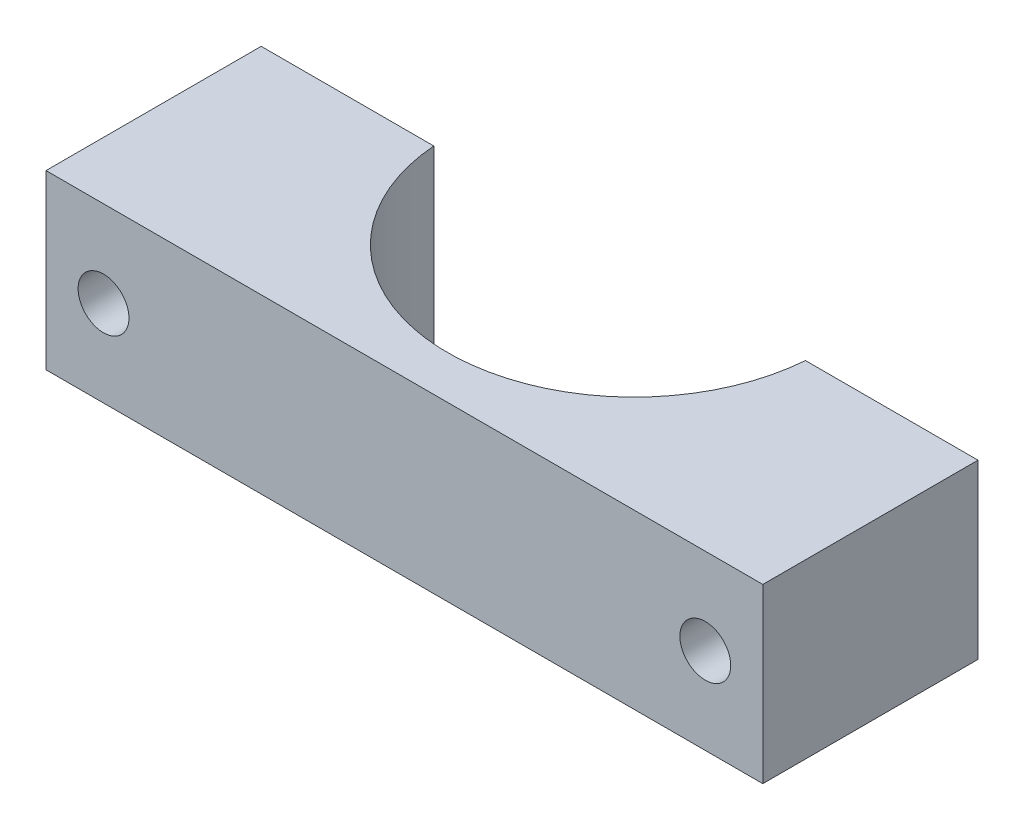
ISO-10303-21;
HEADER;
FILE_DESCRIPTION(('STEP AP214'),'2;1');
FILE_NAME('part.step','',(''),(''),'','','');
FILE_SCHEMA(('AUTOMOTIVE_DESIGN { 1 0 10303 214 1 1 1 1 }'));
ENDSEC;
DATA;
#1=APPLICATION_CONTEXT('core data for automotive mechanical design processes');
#2=APPLICATION_PROTOCOL_DEFINITION('international standard','automotive_design',2000,#1);
#3=PRODUCT_CONTEXT('',#1,'mechanical');
#4=PRODUCT('Part','Part','',(#3));
#5=PRODUCT_RELATED_PRODUCT_CATEGORY('part','',(#4));
#6=PRODUCT_DEFINITION_FORMATION('','',#4);
#7=PRODUCT_DEFINITION_CONTEXT('part definition',#1,'design');
#8=PRODUCT_DEFINITION('design','',#6,#7);
#9=PRODUCT_DEFINITION_SHAPE('','',#8);
#10=(LENGTH_UNIT() NAMED_UNIT(*) SI_UNIT(.MILLI.,.METRE.));
#11=(NAMED_UNIT(*) PLANE_ANGLE_UNIT() SI_UNIT($,.RADIAN.));
#12=(NAMED_UNIT(*) SI_UNIT($,.STERADIAN.) SOLID_ANGLE_UNIT());
#13=UNCERTAINTY_MEASURE_WITH_UNIT(LENGTH_MEASURE(1.E-05),#10,'distance_accuracy_value','');
#14=(GEOMETRIC_REPRESENTATION_CONTEXT(3) GLOBAL_UNCERTAINTY_ASSIGNED_CONTEXT((#13)) GLOBAL_UNIT_ASSIGNED_CONTEXT((#10,
#11,#12)) REPRESENTATION_CONTEXT('',''));
#15=CARTESIAN_POINT('',(0.,0.,0.));
#16=DIRECTION('',(0.,0.,1.));
#17=DIRECTION('',(1.,0.,0.));
#18=AXIS2_PLACEMENT_3D('',#15,#16,#17);
#19=CARTESIAN_POINT('',(39.5630398660067,19.05,25.3365));
#20=DIRECTION('',(0.,0.,-1.));
#21=DIRECTION('',(-1.,0.,0.));
#22=AXIS2_PLACEMENT_3D('',#19,#20,#21);
#23=PLANE('',#22);
#24=CARTESIAN_POINT('',(-33.2130398660067,9.525,25.3365));
#25=DIRECTION('',(0.,0.,1.));
#26=DIRECTION('',(1.,0.,0.));
#27=AXIS2_PLACEMENT_3D('',#24,#25,#26);
#28=CIRCLE('',#27,2.8067);
#29=CARTESIAN_POINT('',(-30.4063398660067,9.525,25.3365));
#30=VERTEX_POINT('',#29);
#31=EDGE_CURVE('E167',#30,#30,#28,.T.);
#32=ORIENTED_EDGE('',*,*,#31,.F.);
#33=EDGE_LOOP('',(#32));
#34=FACE_BOUND('',#33,.T.);
#35=CARTESIAN_POINT('',(33.2130398660067,9.52500000000001,25.3365));
#36=DIRECTION('',(0.,0.,1.));
#37=DIRECTION('',(1.,0.,0.));
#38=AXIS2_PLACEMENT_3D('',#35,#36,#37);
#39=CIRCLE('',#38,2.8067);
#40=CARTESIAN_POINT('',(36.0197398660067,9.52500000000001,25.3365));
#41=VERTEX_POINT('',#40);
#42=EDGE_CURVE('E170',#41,#41,#39,.T.);
#43=ORIENTED_EDGE('',*,*,#42,.F.);
#44=EDGE_LOOP('',(#43));
#45=FACE_BOUND('',#44,.T.);
#46=DIRECTION('',(1.,0.,0.));
#47=VECTOR('',#46,1.);
#48=CARTESIAN_POINT('',(39.5630398660067,0.,25.3365));
#49=LINE('',#48,#47);
#50=CARTESIAN_POINT('',(-39.5630398660067,0.,25.3365));
#51=VERTEX_POINT('',#50);
#52=CARTESIAN_POINT('',(39.5630398660067,0.,25.3365));
#53=VERTEX_POINT('',#52);
#54=EDGE_CURVE('E120',#51,#53,#49,.T.);
#55=ORIENTED_EDGE('',*,*,#54,.T.);
#56=DIRECTION('',(0.,-1.,0.));
#57=VECTOR('',#56,1.);
#58=CARTESIAN_POINT('',(39.5630398660067,19.05,25.3365));
#59=LINE('',#58,#57);
#60=CARTESIAN_POINT('',(39.5630398660067,19.05,25.3365));
#61=VERTEX_POINT('',#60);
#62=EDGE_CURVE('E11',#61,#53,#59,.T.);
#63=ORIENTED_EDGE('',*,*,#62,.F.);
#64=DIRECTION('',(1.,0.,0.));
#65=VECTOR('',#64,1.);
#66=CARTESIAN_POINT('',(39.5630398660067,19.05,25.3365));
#67=LINE('',#66,#65);
#68=CARTESIAN_POINT('',(-39.5630398660067,19.05,25.3365));
#69=VERTEX_POINT('',#68);
#70=EDGE_CURVE('E131',#69,#61,#67,.T.);
#71=ORIENTED_EDGE('',*,*,#70,.F.);
#72=DIRECTION('',(0.,-1.,0.));
#73=VECTOR('',#72,1.);
#74=CARTESIAN_POINT('',(-39.5630398660067,19.05,25.3365));
#75=LINE('',#74,#73);
#76=EDGE_CURVE('E116',#69,#51,#75,.T.);
#77=ORIENTED_EDGE('',*,*,#76,.T.);
#78=EDGE_LOOP('',(#55,#63,#71,#77));
#79=FACE_BOUND('',#78,.T.);
#80=ADVANCED_FACE('F36',(#34,#45,#79),#23,.F.);
#81=CARTESIAN_POINT('',(39.5630398660066,19.05,1.58261538461537));
#82=DIRECTION('',(-1.,0.,0.));
#83=DIRECTION('',(0.,0.,1.));
#84=AXIS2_PLACEMENT_3D('',#81,#82,#83);
#85=PLANE('',#84);
#86=DIRECTION('',(0.,0.,-1.));
#87=VECTOR('',#86,1.);
#88=CARTESIAN_POINT('',(39.5630398660066,0.,1.58261538461537));
#89=LINE('',#88,#87);
#90=CARTESIAN_POINT('',(39.5630398660066,0.,1.58261538461537));
#91=VERTEX_POINT('',#90);
#92=EDGE_CURVE('E123',#53,#91,#89,.T.);
#93=ORIENTED_EDGE('',*,*,#92,.T.);
#94=DIRECTION('',(0.,-1.,0.));
#95=VECTOR('',#94,1.);
#96=CARTESIAN_POINT('',(39.5630398660066,19.05,1.58261538461537));
#97=LINE('',#96,#95);
#98=CARTESIAN_POINT('',(39.5630398660066,19.05,1.58261538461537));
#99=VERTEX_POINT('',#98);
#100=EDGE_CURVE('E44',#99,#91,#97,.T.);
#101=ORIENTED_EDGE('',*,*,#100,.F.);
#102=DIRECTION('',(0.,0.,-1.));
#103=VECTOR('',#102,1.);
#104=CARTESIAN_POINT('',(39.5630398660066,19.05,1.58261538461537));
#105=LINE('',#104,#103);
#106=EDGE_CURVE('E89',#61,#99,#105,.T.);
#107=ORIENTED_EDGE('',*,*,#106,.F.);
#108=ORIENTED_EDGE('',*,*,#62,.T.);
#109=EDGE_LOOP('',(#93,#101,#107,#108));
#110=FACE_BOUND('',#109,.T.);
#111=ADVANCED_FACE('F157',(#110),#85,.F.);
#112=CARTESIAN_POINT('',(20.5130398660067,19.05,1.58261538461538));
#113=DIRECTION('',(0.,0.,1.));
#114=DIRECTION('',(1.,0.,0.));
#115=AXIS2_PLACEMENT_3D('',#112,#113,#114);
#116=PLANE('',#115);
#117=CARTESIAN_POINT('',(33.2130398660067,9.52500000000001,1.58261538461537));
#118=DIRECTION('',(0.,0.,1.));
#119=DIRECTION('',(1.,0.,0.));
#120=AXIS2_PLACEMENT_3D('',#117,#118,#119);
#121=CIRCLE('',#120,2.8067);
#122=CARTESIAN_POINT('',(36.0197398660067,9.52500000000001,1.58261538461537));
#123=VERTEX_POINT('',#122);
#124=EDGE_CURVE('E124',#123,#123,#121,.T.);
#125=ORIENTED_EDGE('',*,*,#124,.T.);
#126=EDGE_LOOP('',(#125));
#127=FACE_BOUND('',#126,.T.);
#128=DIRECTION('',(-1.,0.,0.));
#129=VECTOR('',#128,1.);
#130=CARTESIAN_POINT('',(20.5130398660067,0.,1.58261538461538));
#131=LINE('',#130,#129);
#132=CARTESIAN_POINT('',(20.5130398660067,0.,1.58261538461538));
#133=VERTEX_POINT('',#132);
#134=EDGE_CURVE('E126',#91,#133,#131,.T.);
#135=ORIENTED_EDGE('',*,*,#134,.T.);
#136=DIRECTION('',(0.,-1.,0.));
#137=VECTOR('',#136,1.);
#138=CARTESIAN_POINT('',(20.5130398660067,19.05,1.58261538461538));
#139=LINE('',#138,#137);
#140=CARTESIAN_POINT('',(20.5130398660067,19.05,1.58261538461538));
#141=VERTEX_POINT('',#140);
#142=EDGE_CURVE('E111',#141,#133,#139,.T.);
#143=ORIENTED_EDGE('',*,*,#142,.F.);
#144=DIRECTION('',(-1.,0.,0.));
#145=VECTOR('',#144,1.);
#146=CARTESIAN_POINT('',(20.5130398660067,19.05,1.58261538461538));
#147=LINE('',#146,#145);
#148=EDGE_CURVE('E102',#99,#141,#147,.T.);
#149=ORIENTED_EDGE('',*,*,#148,.F.);
#150=ORIENTED_EDGE('',*,*,#100,.T.);
#151=EDGE_LOOP('',(#135,#143,#149,#150));
#152=FACE_BOUND('',#151,.T.);
#153=ADVANCED_FACE('F137',(#127,#152),#116,.F.);
#154=CARTESIAN_POINT('',(0.,19.05,0.));
#155=DIRECTION('',(0.,-1.,0.));
#156=DIRECTION('',(0.,0.,-1.));
#157=AXIS2_PLACEMENT_3D('',#154,#155,#156);
#158=CYLINDRICAL_SURFACE('',#157,20.574);
#159=CARTESIAN_POINT('',(0.,0.,0.));
#160=DIRECTION('',(0.,-1.,0.));
#161=DIRECTION('',(0.,0.,1.));
#162=AXIS2_PLACEMENT_3D('',#159,#160,#161);
#163=CIRCLE('',#162,20.574);
#164=CARTESIAN_POINT('',(-20.5130398660067,0.,1.58261538461538));
#165=VERTEX_POINT('',#164);
#166=EDGE_CURVE('E110',#133,#165,#163,.T.);
#167=ORIENTED_EDGE('',*,*,#166,.T.);
#168=DIRECTION('',(0.,-1.,0.));
#169=VECTOR('',#168,1.);
#170=CARTESIAN_POINT('',(-20.5130398660067,19.05,1.58261538461538));
#171=LINE('',#170,#169);
#172=CARTESIAN_POINT('',(-20.5130398660067,19.05,1.58261538461538));
#173=VERTEX_POINT('',#172);
#174=EDGE_CURVE('E107',#173,#165,#171,.T.);
#175=ORIENTED_EDGE('',*,*,#174,.F.);
#176=CARTESIAN_POINT('',(0.,19.05,0.));
#177=DIRECTION('',(0.,-1.,0.));
#178=DIRECTION('',(0.,0.,1.));
#179=AXIS2_PLACEMENT_3D('',#176,#177,#178);
#180=CIRCLE('',#179,20.574);
#181=EDGE_CURVE('E96',#141,#173,#180,.T.);
#182=ORIENTED_EDGE('',*,*,#181,.F.);
#183=ORIENTED_EDGE('',*,*,#142,.T.);
#184=EDGE_LOOP('',(#167,#175,#182,#183));
#185=FACE_BOUND('',#184,.T.);
#186=ADVANCED_FACE('F108',(#185),#158,.F.);
#187=CARTESIAN_POINT('',(-20.5130398660067,19.05,1.58261538461539));
#188=DIRECTION('',(0.,0.,1.));
#189=DIRECTION('',(1.,0.,0.));
#190=AXIS2_PLACEMENT_3D('',#187,#188,#189);
#191=PLANE('',#190);
#192=CARTESIAN_POINT('',(-33.2130398660067,9.525,1.58261538461537));
#193=DIRECTION('',(0.,0.,1.));
#194=DIRECTION('',(1.,0.,0.));
#195=AXIS2_PLACEMENT_3D('',#192,#193,#194);
#196=CIRCLE('',#195,2.8067);
#197=CARTESIAN_POINT('',(-30.4063398660067,9.525,1.58261538461537));
#198=VERTEX_POINT('',#197);
#199=EDGE_CURVE('E172',#198,#198,#196,.T.);
#200=ORIENTED_EDGE('',*,*,#199,.T.);
#201=EDGE_LOOP('',(#200));
#202=FACE_BOUND('',#201,.T.);
#203=DIRECTION('',(-1.,0.,0.));
#204=VECTOR('',#203,1.);
#205=CARTESIAN_POINT('',(-20.5130398660067,0.,1.58261538461539));
#206=LINE('',#205,#204);
#207=CARTESIAN_POINT('',(-39.5630398660067,0.,1.58261538461539));
#208=VERTEX_POINT('',#207);
#209=EDGE_CURVE('E75',#165,#208,#206,.T.);
#210=ORIENTED_EDGE('',*,*,#209,.T.);
#211=DIRECTION('',(0.,-1.,0.));
#212=VECTOR('',#211,1.);
#213=CARTESIAN_POINT('',(-39.5630398660067,19.05,1.58261538461539));
#214=LINE('',#213,#212);
#215=CARTESIAN_POINT('',(-39.5630398660067,19.05,1.58261538461539));
#216=VERTEX_POINT('',#215);
#217=EDGE_CURVE('E112',#216,#208,#214,.T.);
#218=ORIENTED_EDGE('',*,*,#217,.F.);
#219=DIRECTION('',(-1.,0.,0.));
#220=VECTOR('',#219,1.);
#221=CARTESIAN_POINT('',(-20.5130398660067,19.05,1.58261538461539));
#222=LINE('',#221,#220);
#223=EDGE_CURVE('E100',#173,#216,#222,.T.);
#224=ORIENTED_EDGE('',*,*,#223,.F.);
#225=ORIENTED_EDGE('',*,*,#174,.T.);
#226=EDGE_LOOP('',(#210,#218,#224,#225));
#227=FACE_BOUND('',#226,.T.);
#228=ADVANCED_FACE('F114',(#202,#227),#191,.F.);
#229=CARTESIAN_POINT('',(-39.5630398660067,19.05,25.3365));
#230=DIRECTION('',(1.,0.,0.));
#231=DIRECTION('',(0.,0.,-1.));
#232=AXIS2_PLACEMENT_3D('',#229,#230,#231);
#233=PLANE('',#232);
#234=DIRECTION('',(0.,0.,1.));
#235=VECTOR('',#234,1.);
#236=CARTESIAN_POINT('',(-39.5630398660067,0.,25.3365));
#237=LINE('',#236,#235);
#238=EDGE_CURVE('E81',#208,#51,#237,.T.);
#239=ORIENTED_EDGE('',*,*,#238,.T.);
#240=ORIENTED_EDGE('',*,*,#76,.F.);
#241=DIRECTION('',(0.,0.,1.));
#242=VECTOR('',#241,1.);
#243=CARTESIAN_POINT('',(-39.5630398660067,19.05,25.3365));
#244=LINE('',#243,#242);
#245=EDGE_CURVE('E52',#216,#69,#244,.T.);
#246=ORIENTED_EDGE('',*,*,#245,.F.);
#247=ORIENTED_EDGE('',*,*,#217,.T.);
#248=EDGE_LOOP('',(#239,#240,#246,#247));
#249=FACE_BOUND('',#248,.T.);
#250=ADVANCED_FACE('F144',(#249),#233,.F.);
#251=CARTESIAN_POINT('',(0.,19.05,0.));
#252=DIRECTION('',(0.,1.,0.));
#253=DIRECTION('',(0.,0.,1.));
#254=AXIS2_PLACEMENT_3D('',#251,#252,#253);
#255=PLANE('',#254);
#256=ORIENTED_EDGE('',*,*,#70,.T.);
#257=ORIENTED_EDGE('',*,*,#106,.T.);
#258=ORIENTED_EDGE('',*,*,#148,.T.);
#259=ORIENTED_EDGE('',*,*,#181,.T.);
#260=ORIENTED_EDGE('',*,*,#223,.T.);
#261=ORIENTED_EDGE('',*,*,#245,.T.);
#262=EDGE_LOOP('',(#256,#257,#258,#259,#260,#261));
#263=FACE_BOUND('',#262,.T.);
#264=ADVANCED_FACE('F98',(#263),#255,.T.);
#265=CARTESIAN_POINT('',(0.,0.,0.));
#266=DIRECTION('',(0.,1.,0.));
#267=DIRECTION('',(0.,0.,1.));
#268=AXIS2_PLACEMENT_3D('',#265,#266,#267);
#269=PLANE('',#268);
#270=ORIENTED_EDGE('',*,*,#54,.F.);
#271=ORIENTED_EDGE('',*,*,#238,.F.);
#272=ORIENTED_EDGE('',*,*,#209,.F.);
#273=ORIENTED_EDGE('',*,*,#166,.F.);
#274=ORIENTED_EDGE('',*,*,#134,.F.);
#275=ORIENTED_EDGE('',*,*,#92,.F.);
#276=EDGE_LOOP('',(#270,#271,#272,#273,#274,#275));
#277=FACE_BOUND('',#276,.T.);
#278=ADVANCED_FACE('F140',(#277),#269,.F.);
#279=CARTESIAN_POINT('',(33.2130398660067,9.52500000000001,25.3365));
#280=DIRECTION('',(0.,0.,1.));
#281=DIRECTION('',(1.,0.,0.));
#282=AXIS2_PLACEMENT_3D('',#279,#280,#281);
#283=CYLINDRICAL_SURFACE('',#282,2.8067);
#284=ORIENTED_EDGE('',*,*,#124,.F.);
#285=EDGE_LOOP('',(#284));
#286=FACE_BOUND('',#285,.T.);
#287=ORIENTED_EDGE('',*,*,#42,.T.);
#288=EDGE_LOOP('',(#287));
#289=FACE_BOUND('',#288,.T.);
#290=ADVANCED_FACE('F184',(#286,#289),#283,.F.);
#291=CARTESIAN_POINT('',(-33.2130398660067,9.525,25.3365));
#292=DIRECTION('',(0.,0.,1.));
#293=DIRECTION('',(1.,0.,0.));
#294=AXIS2_PLACEMENT_3D('',#291,#292,#293);
#295=CYLINDRICAL_SURFACE('',#294,2.8067);
#296=ORIENTED_EDGE('',*,*,#199,.F.);
#297=EDGE_LOOP('',(#296));
#298=FACE_BOUND('',#297,.T.);
#299=ORIENTED_EDGE('',*,*,#31,.T.);
#300=EDGE_LOOP('',(#299));
#301=FACE_BOUND('',#300,.T.);
#302=ADVANCED_FACE('F182',(#298,#301),#295,.F.);
#303=CLOSED_SHELL('',(#80,#111,#153,#186,#228,#250,#264,#278,#290,#302));
#304=MANIFOLD_SOLID_BREP('B2',#303);
#305=ADVANCED_BREP_SHAPE_REPRESENTATION('',(#18,#304),#14);
#306=SHAPE_DEFINITION_REPRESENTATION(#9,#305);
ENDSEC;
END-ISO-10303-21;
